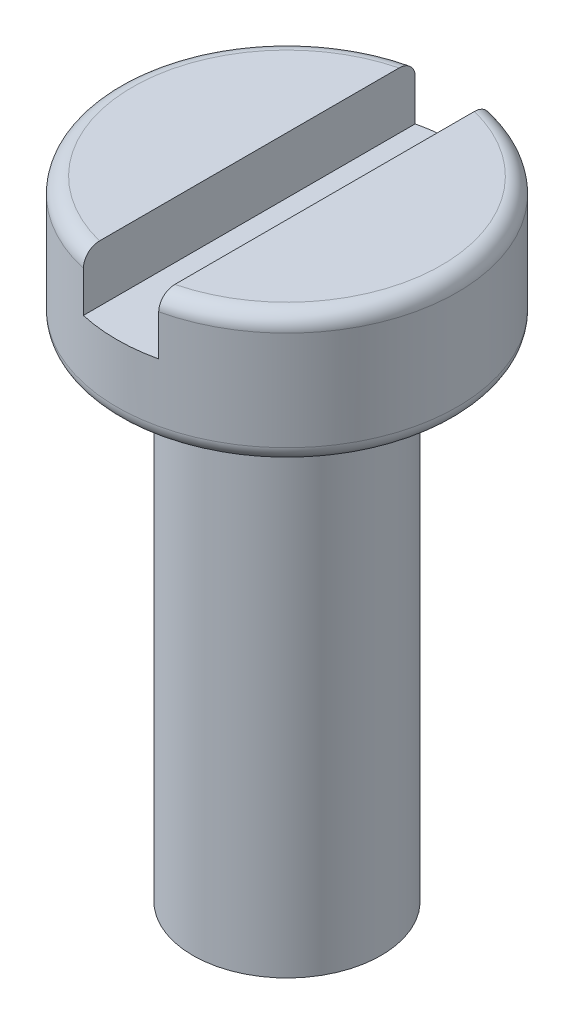
ISO-10303-21;
HEADER;
FILE_DESCRIPTION(('STEP AP214'),'2;1');
FILE_NAME('part.step','',(''),(''),'','','');
FILE_SCHEMA(('AUTOMOTIVE_DESIGN { 1 0 10303 214 1 1 1 1 }'));
ENDSEC;
DATA;
#1=APPLICATION_CONTEXT('core data for automotive mechanical design processes');
#2=APPLICATION_PROTOCOL_DEFINITION('international standard','automotive_design',2000,#1);
#3=PRODUCT_CONTEXT('',#1,'mechanical');
#4=PRODUCT('Part','Part','',(#3));
#5=PRODUCT_RELATED_PRODUCT_CATEGORY('part','',(#4));
#6=PRODUCT_DEFINITION_FORMATION('','',#4);
#7=PRODUCT_DEFINITION_CONTEXT('part definition',#1,'design');
#8=PRODUCT_DEFINITION('design','',#6,#7);
#9=PRODUCT_DEFINITION_SHAPE('','',#8);
#10=(LENGTH_UNIT() NAMED_UNIT(*) SI_UNIT(.MILLI.,.METRE.));
#11=(NAMED_UNIT(*) PLANE_ANGLE_UNIT() SI_UNIT($,.RADIAN.));
#12=(NAMED_UNIT(*) SI_UNIT($,.STERADIAN.) SOLID_ANGLE_UNIT());
#13=UNCERTAINTY_MEASURE_WITH_UNIT(LENGTH_MEASURE(1.E-05),#10,'distance_accuracy_value','');
#14=(GEOMETRIC_REPRESENTATION_CONTEXT(3) GLOBAL_UNCERTAINTY_ASSIGNED_CONTEXT((#13)) GLOBAL_UNIT_ASSIGNED_CONTEXT((#10,
#11,#12)) REPRESENTATION_CONTEXT('',''));
#15=CARTESIAN_POINT('',(0.,0.,0.));
#16=DIRECTION('',(0.,0.,1.));
#17=DIRECTION('',(1.,0.,0.));
#18=AXIS2_PLACEMENT_3D('',#15,#16,#17);
#19=CARTESIAN_POINT('',(0.,20.,0.));
#20=DIRECTION('',(0.,-1.,0.));
#21=DIRECTION('',(0.,0.,-1.));
#22=AXIS2_PLACEMENT_3D('',#19,#20,#21);
#23=PLANE('',#22);
#24=CARTESIAN_POINT('',(0.,20.,0.));
#25=DIRECTION('',(0.,-1.,0.));
#26=DIRECTION('',(0.,0.,-1.));
#27=AXIS2_PLACEMENT_3D('',#24,#25,#26);
#28=CIRCLE('',#27,2.46);
#29=CARTESIAN_POINT('',(-0.6,20.,-2.38570744224846));
#30=VERTEX_POINT('',#29);
#31=CARTESIAN_POINT('',(-0.6,20.,2.3857074422486));
#32=VERTEX_POINT('',#31);
#33=EDGE_CURVE('E104',#30,#32,#28,.F.);
#34=ORIENTED_EDGE('',*,*,#33,.T.);
#35=DIRECTION('',(0.,0.,1.));
#36=VECTOR('',#35,1.);
#37=CARTESIAN_POINT('',(-0.6,20.,2.71102334228302));
#38=LINE('',#37,#36);
#39=EDGE_CURVE('E101',#30,#32,#38,.T.);
#40=ORIENTED_EDGE('',*,*,#39,.F.);
#41=EDGE_LOOP('',(#34,#40));
#42=FACE_BOUND('',#41,.T.);
#43=ADVANCED_FACE('F35',(#42),#23,.F.);
#44=CARTESIAN_POINT('',(0.,19.75,0.));
#45=DIRECTION('',(0.,-1.,0.));
#46=DIRECTION('',(0.,0.,-1.));
#47=AXIS2_PLACEMENT_3D('',#44,#45,#46);
#48=TOROIDAL_SURFACE('',#47,2.46,0.25);
#49=CARTESIAN_POINT('',(-0.6,19.9057779269637,2.58686231688076));
#50=CARTESIAN_POINT('',(-0.6,19.8950398183509,2.5956435679496));
#51=CARTESIAN_POINT('',(-0.6,19.8835649113459,2.60353742344512));
#52=CARTESIAN_POINT('',(-0.6,19.8594480937063,2.61730071427246));
#53=CARTESIAN_POINT('',(-0.6,19.846805116745,2.62316827619331));
#54=CARTESIAN_POINT('',(-0.6,19.8207049337922,2.63268735414627));
#55=CARTESIAN_POINT('',(-0.6,19.8072475164309,2.63633829216775));
#56=CARTESIAN_POINT('',(-0.6,19.7799107452415,2.64130101178219));
#57=CARTESIAN_POINT('',(-0.6,19.7660314865879,2.64261331708466));
#58=CARTESIAN_POINT('',(-0.6,19.738395178757,2.64285617965291));
#59=CARTESIAN_POINT('',(-0.6,19.7246383380415,2.64181105425246));
#60=CARTESIAN_POINT('',(-0.6,19.6974964874994,2.6374228928476));
#61=CARTESIAN_POINT('',(-0.6,19.6841114783171,2.63407985286123));
#62=CARTESIAN_POINT('',(-0.6,19.6581028909833,2.62520726129129));
#63=CARTESIAN_POINT('',(-0.6,19.645478566111,2.61967989560636));
#64=CARTESIAN_POINT('',(-0.6,19.6213204884943,2.60661096468353));
#65=CARTESIAN_POINT('',(-0.6,19.609786785512,2.59906930759908));
#66=CARTESIAN_POINT('',(-0.6,19.5879670918565,2.58208635128699));
#67=CARTESIAN_POINT('',(-0.6,19.5776997639723,2.57262109024571));
#68=CARTESIAN_POINT('',(-0.6,19.5588555560857,2.55213651548936));
#69=CARTESIAN_POINT('',(-0.6,19.5502788528209,2.54111703950326));
#70=CARTESIAN_POINT('',(-0.6,19.5348419859735,2.51756279317136));
#71=CARTESIAN_POINT('',(-0.6,19.5280268479349,2.50499852227153));
#72=CARTESIAN_POINT('',(-0.6,19.5165412180445,2.47892562165189));
#73=CARTESIAN_POINT('',(-0.6,19.5118710171225,2.46541686411225));
#74=CARTESIAN_POINT('',(-0.6,19.5046834040679,2.43746147305775));
#75=CARTESIAN_POINT('',(-0.6,19.5022253760787,2.42299956182772));
#76=CARTESIAN_POINT('',(-0.6,19.4997225636304,2.39386809017465));
#77=CARTESIAN_POINT('',(-0.6,19.4996780748111,2.37919850453324));
#78=CARTESIAN_POINT('',(-0.6,19.5020180153436,2.3497740984476));
#79=CARTESIAN_POINT('',(-0.6,19.5044483852974,2.3350229106946));
#80=CARTESIAN_POINT('',(-0.6,19.5117449070815,2.30613455183196));
#81=CARTESIAN_POINT('',(-0.6,19.5166111916129,2.29199741421948));
#82=CARTESIAN_POINT('',(-0.6,19.5286718984968,2.26471817845948));
#83=CARTESIAN_POINT('',(-0.6,19.5358709457048,2.25157812149445));
#84=CARTESIAN_POINT('',(-0.6,19.5524143077675,2.22672417348261));
#85=CARTESIAN_POINT('',(-0.6,19.5617584549328,2.21501017106599));
#86=CARTESIAN_POINT('',(-0.6,19.5821446976601,2.19359931327809));
#87=CARTESIAN_POINT('',(-0.6,19.5931500850528,2.18386754370457));
#88=CARTESIAN_POINT('',(-0.6,19.6166881125292,2.16646889601282));
#89=CARTESIAN_POINT('',(-0.6,19.6292204309981,2.15880158414973));
#90=CARTESIAN_POINT('',(-0.6,19.654994143128,2.14603352411427));
#91=CARTESIAN_POINT('',(-0.6,19.6681962508577,2.14085347697661));
#92=CARTESIAN_POINT('',(-0.6,19.6952992227209,2.13286505733002));
#93=CARTESIAN_POINT('',(-0.6,19.7091999374493,2.13005617998664));
#94=CARTESIAN_POINT('',(-0.6,19.7368363949329,2.12696449025801));
#95=CARTESIAN_POINT('',(-0.6,19.7505636233152,2.12660516557791));
#96=CARTESIAN_POINT('',(-0.6,19.7778789014398,2.12822242302424));
#97=CARTESIAN_POINT('',(-0.6,19.7914669628874,2.13019880703996));
#98=CARTESIAN_POINT('',(-0.6,19.8179788523567,2.13638478002833));
#99=CARTESIAN_POINT('',(-0.6,19.8309079857046,2.14057171283409));
#100=CARTESIAN_POINT('',(-0.6,19.8558965522215,2.15102236109181));
#101=CARTESIAN_POINT('',(-0.6,19.8679559346654,2.15728619755261));
#102=CARTESIAN_POINT('',(-0.6,19.8910843669919,2.17180899084781));
#103=CARTESIAN_POINT('',(-0.6,19.9021337939875,2.18009916085056));
#104=CARTESIAN_POINT('',(-0.6,19.9227404635454,2.19836203634967));
#105=CARTESIAN_POINT('',(-0.6,19.9322974761134,2.20833500068789));
#106=CARTESIAN_POINT('',(-0.6,19.9499851160373,2.23003056226405));
#107=CARTESIAN_POINT('',(-0.6,19.958058183776,2.24180007994945));
#108=CARTESIAN_POINT('',(-0.6,19.972186772722,2.26649331028083));
#109=CARTESIAN_POINT('',(-0.6,19.9782419447608,2.27941722218843));
#110=CARTESIAN_POINT('',(-0.6,19.9883586493524,2.30650202512867));
#111=CARTESIAN_POINT('',(-0.6,19.9923493322226,2.32068941039095));
#112=CARTESIAN_POINT('',(-0.6,19.9979369938959,2.34952799110328));
#113=CARTESIAN_POINT('',(-0.6,19.9995337847543,2.36417922287773));
#114=CARTESIAN_POINT('',(-0.6,20.000296327843,2.39379345631476));
#115=CARTESIAN_POINT('',(-0.6,19.9994206262247,2.40875754873725));
#116=CARTESIAN_POINT('',(-0.6,19.9951594147004,2.43832912201416));
#117=CARTESIAN_POINT('',(-0.6,19.9917732700265,2.45293651171087));
#118=CARTESIAN_POINT('',(-0.6,19.9825823199898,2.48131275745753));
#119=CARTESIAN_POINT('',(-0.6,19.9767860479825,2.49508437744055));
#120=CARTESIAN_POINT('',(-0.6,19.9629195439454,2.5214172843565));
#121=CARTESIAN_POINT('',(-0.6,19.9548522718015,2.53398011833989));
#122=CARTESIAN_POINT('',(-0.6,19.9399012555252,2.55332109446276));
#123=CARTESIAN_POINT('',(-0.6,19.9336151471017,2.56056880475899));
#124=CARTESIAN_POINT('',(-0.6,19.9202625315426,2.57430626948078));
#125=CARTESIAN_POINT('',(-0.6,19.9131960419394,2.58079604092775));
#126=CARTESIAN_POINT('',(-0.6,19.9057779269637,2.58686231688076));
#127=B_SPLINE_CURVE_WITH_KNOTS('',3,(#49,#50,#51,#52,#53,#54,#55,#56,#57,#58,#59,#60,#61,#62,
#63,#64,#65,#66,#67,#68,#69,#70,#71,#72,#73,#74,#75,#76,#77,#78,#79,#80,#81,#82,#83,#84,#85,#86,
#87,#88,#89,#90,#91,#92,#93,#94,#95,#96,#97,#98,#99,#100,#101,#102,#103,#104,#105,#106,#107,
#108,#109,#110,#111,#112,#113,#114,#115,#116,#117,#118,#119,#120,#121,#122,#123,#124,#125,#126),
.UNSPECIFIED.,.T.,.F.,(4,2,2,2,2,2,2,2,2,2,2,2,2,2,2,2,2,2,2,2,2,2,2,2,2,2,2,2,2,2,2,2,2,2,2,2,
2,2,4),(0.,0.0415802938971037,0.083198928600957,0.124828411195371,0.166448570180792,
0.207641375076417,0.248834251353299,0.289986009055909,0.331139643494163,0.372841362924238,
0.414547439535753,0.457232632476987,0.499923613339573,0.543729095436656,0.587539943353091,
0.632179143563909,0.676820775845968,0.721551460228282,0.766278649058879,0.810132680496136,
0.853977490950431,0.896312268610293,0.938638030699984,0.979635425017785,1.02062934225808,
1.06121103910052,1.10179510081268,1.14304877711473,1.18430880471495,1.22693204392473,
1.26956265466308,1.3135726975485,1.35758619548361,1.40234198477537,1.44710909447208,
1.49171903241248,1.53627109549314,1.56499629658943,1.59372085246534),.UNSPECIFIED.);
#128=CARTESIAN_POINT('',(-0.6,19.75,2.64274478525649));
#129=VERTEX_POINT('',#128);
#130=EDGE_CURVE('E58',#32,#129,#127,.T.);
#131=ORIENTED_EDGE('',*,*,#130,.F.);
#132=ORIENTED_EDGE('',*,*,#33,.F.);
#133=CARTESIAN_POINT('',(-0.6,19.8944024686671,-2.17466848008618));
#134=CARTESIAN_POINT('',(-0.6,19.883309846262,-2.16652688736432));
#135=CARTESIAN_POINT('',(-0.6,19.8715393901536,-2.15929544056344));
#136=CARTESIAN_POINT('',(-0.6,19.8469488212528,-2.14689265741792));
#137=CARTESIAN_POINT('',(-0.6,19.8341278870049,-2.14172295221508));
#138=CARTESIAN_POINT('',(-0.6,19.8077853460394,-2.13362409480365));
#139=CARTESIAN_POINT('',(-0.6,19.794263294155,-2.13069638519483));
#140=CARTESIAN_POINT('',(-0.6,19.7669202433074,-2.12719403278441));
#141=CARTESIAN_POINT('',(-0.6,19.7530993134886,-2.12661885146695));
#142=CARTESIAN_POINT('',(-0.6,19.7257732920088,-2.12783146110016));
#143=CARTESIAN_POINT('',(-0.6,19.712266594452,-2.12958343059428));
#144=CARTESIAN_POINT('',(-0.6,19.6857384749176,-2.13532569735921));
#145=CARTESIAN_POINT('',(-0.6,19.6727170604,-2.13931602902404));
#146=CARTESIAN_POINT('',(-0.6,19.6474863404887,-2.1494105923049));
#147=CARTESIAN_POINT('',(-0.6,19.635279076258,-2.15551991523306));
#148=CARTESIAN_POINT('',(-0.6,19.6120284455293,-2.16965153318031));
#149=CARTESIAN_POINT('',(-0.6,19.6009852039983,-2.17767403329327));
#150=CARTESIAN_POINT('',(-0.6,19.5800642470021,-2.19561844754873));
#151=CARTESIAN_POINT('',(-0.6,19.5702241638525,-2.20558420676426));
#152=CARTESIAN_POINT('',(-0.6,19.5522879155651,-2.22697713536075));
#153=CARTESIAN_POINT('',(-0.6,19.5441920464871,-2.23840455231715));
#154=CARTESIAN_POINT('',(-0.6,19.5296784229926,-2.26282410847462));
#155=CARTESIAN_POINT('',(-0.6,19.5233291210497,-2.27585694646556));
#156=CARTESIAN_POINT('',(-0.6,19.5128429916506,-2.30278438881787));
#157=CARTESIAN_POINT('',(-0.6,19.5087065078549,-2.31667912666237));
#158=CARTESIAN_POINT('',(-0.6,19.5026635081991,-2.34533487622194));
#159=CARTESIAN_POINT('',(-0.6,19.500819560799,-2.36010911604456));
#160=CARTESIAN_POINT('',(-0.6,19.4996171492246,-2.38975919377417));
#161=CARTESIAN_POINT('',(-0.6,19.500258861375,-2.40463503881397));
#162=CARTESIAN_POINT('',(-0.6,19.5040358851863,-2.43418181941932));
#163=CARTESIAN_POINT('',(-0.6,19.5071898869517,-2.44885037722511));
#164=CARTESIAN_POINT('',(-0.6,19.5159467663178,-2.47743847402221));
#165=CARTESIAN_POINT('',(-0.6,19.5215495385545,-2.49135804521147));
#166=CARTESIAN_POINT('',(-0.6,19.5349828775226,-2.51785900108877));
#167=CARTESIAN_POINT('',(-0.6,19.5427846303755,-2.53045497621151));
#168=CARTESIAN_POINT('',(-0.6,19.5604427436654,-2.55411450413128));
#169=CARTESIAN_POINT('',(-0.6,19.5702988333929,-2.56517825851681));
#170=CARTESIAN_POINT('',(-0.6,19.5915255957485,-2.58516246124834));
#171=CARTESIAN_POINT('',(-0.6,19.6028525595357,-2.59412932678523));
#172=CARTESIAN_POINT('',(-0.6,19.6268844133151,-2.60997367876158));
#173=CARTESIAN_POINT('',(-0.6,19.639589089596,-2.61685148862899));
#174=CARTESIAN_POINT('',(-0.6,19.665659389012,-2.6281382460571));
#175=CARTESIAN_POINT('',(-0.6,19.6789992721377,-2.6326066819527));
#176=CARTESIAN_POINT('',(-0.6,19.7062466045649,-2.6391957173654));
#177=CARTESIAN_POINT('',(-0.6,19.7201539880588,-2.64131658831051));
#178=CARTESIAN_POINT('',(-0.6,19.7478812567646,-2.64312421655654));
#179=CARTESIAN_POINT('',(-0.6,19.7616984300182,-2.64285282687362));
#180=CARTESIAN_POINT('',(-0.6,19.7890887423948,-2.63998487487521));
#181=CARTESIAN_POINT('',(-0.6,19.8026618917013,-2.63738840981912));
#182=CARTESIAN_POINT('',(-0.6,19.8291322877508,-2.62996726244901));
#183=CARTESIAN_POINT('',(-0.6,19.8420317379529,-2.62515042644825));
#184=CARTESIAN_POINT('',(-0.6,19.8668513236063,-2.61344256334287));
#185=CARTESIAN_POINT('',(-0.6,19.8787714252024,-2.60655146457123));
#186=CARTESIAN_POINT('',(-0.6,19.901442031466,-2.59081746857535));
#187=CARTESIAN_POINT('',(-0.6,19.9121780352306,-2.58195369313075));
#188=CARTESIAN_POINT('',(-0.6,19.9320495300079,-2.56258513390767));
#189=CARTESIAN_POINT('',(-0.6,19.9411848615979,-2.55208018686957));
#190=CARTESIAN_POINT('',(-0.6,19.9578158880632,-2.52948107517064));
#191=CARTESIAN_POINT('',(-0.6,19.9652706100935,-2.51735676836809));
#192=CARTESIAN_POINT('',(-0.6,19.9780989930115,-2.49205357024425));
#193=CARTESIAN_POINT('',(-0.6,19.983472374073,-2.47887453740736));
#194=CARTESIAN_POINT('',(-0.6,19.9921323415263,-2.45146527387591));
#195=CARTESIAN_POINT('',(-0.6,19.9953602692204,-2.43721650353487));
#196=CARTESIAN_POINT('',(-0.6,19.9994319700037,-2.40838263421632));
#197=CARTESIAN_POINT('',(-0.6,20.0002755259457,-2.39379750472817));
#198=CARTESIAN_POINT('',(-0.6,19.999559832905,-2.36438314286838));
#199=CARTESIAN_POINT('',(-0.6,19.9979504524109,-2.34955511187288));
#200=CARTESIAN_POINT('',(-0.6,19.9922792732344,-2.3203705929169));
#201=CARTESIAN_POINT('',(-0.6,19.9882167164322,-2.3060142521724));
#202=CARTESIAN_POINT('',(-0.6,19.9777097480094,-2.27810596316031));
#203=CARTESIAN_POINT('',(-0.6,19.9712516736316,-2.2645591569393));
#204=CARTESIAN_POINT('',(-0.6,19.9561211900623,-2.23877753931798));
#205=CARTESIAN_POINT('',(-0.6,19.9474515009904,-2.22654114227506));
#206=CARTESIAN_POINT('',(-0.6,19.9313801864166,-2.20759176204346));
#207=CARTESIAN_POINT('',(-0.6,19.9245303985509,-2.20040383931934));
#208=CARTESIAN_POINT('',(-0.6,19.9100385586368,-2.1868758926182));
#209=CARTESIAN_POINT('',(-0.6,19.9023965328193,-2.18053584058426));
#210=CARTESIAN_POINT('',(-0.6,19.8944024686671,-2.17466848008618));
#211=B_SPLINE_CURVE_WITH_KNOTS('',3,(#133,#134,#135,#136,#137,#138,#139,#140,#141,#142,#143,
#144,#145,#146,#147,#148,#149,#150,#151,#152,#153,#154,#155,#156,#157,#158,#159,#160,#161,#162,
#163,#164,#165,#166,#167,#168,#169,#170,#171,#172,#173,#174,#175,#176,#177,#178,#179,#180,#181,
#182,#183,#184,#185,#186,#187,#188,#189,#190,#191,#192,#193,#194,#195,#196,#197,#198,#199,#200,
#201,#202,#203,#204,#205,#206,#207,#208,#209,#210),.UNSPECIFIED.,.T.,.F.,(4,2,2,2,2,2,2,2,2,2,2,
2,2,2,2,2,2,2,2,2,2,2,2,2,2,2,2,2,2,2,2,2,2,2,2,2,2,2,4),(0.,0.041244633660872,
0.0825218334872765,0.123825570637018,0.165119852443379,0.205785806789995,0.246452386014894,
0.287217359785701,0.327986705554893,0.369812851829636,0.411646092017453,0.454939786369004,
0.498240202472458,0.542698143433272,0.587159238152734,0.63195422432254,0.67674728327372,
0.720978707422788,0.765204306670547,0.808331228569678,0.851451470144276,0.893451661420113,
0.935446996080551,0.976709093215098,1.01796946441029,1.05908513509269,1.10020222650887,
1.14177714209757,1.18335619609043,1.22585974121034,1.26836899874418,1.31199731328668,
1.3556296009759,1.40016564967373,1.44471546866291,1.48952338396887,1.534276452409,
1.56400099805382,1.59372455983925),.UNSPECIFIED.);
#212=CARTESIAN_POINT('',(-0.6,19.75,-2.64274478525636));
#213=VERTEX_POINT('',#212);
#214=EDGE_CURVE('E94',#213,#30,#211,.T.);
#215=ORIENTED_EDGE('',*,*,#214,.F.);
#216=CARTESIAN_POINT('',(0.,19.75,0.));
#217=DIRECTION('',(0.,-1.,0.));
#218=DIRECTION('',(0.,0.,-1.));
#219=AXIS2_PLACEMENT_3D('',#216,#217,#218);
#220=CIRCLE('',#219,2.71);
#221=EDGE_CURVE('E109',#129,#213,#220,.T.);
#222=ORIENTED_EDGE('',*,*,#221,.F.);
#223=EDGE_LOOP('',(#131,#132,#215,#222));
#224=FACE_BOUND('',#223,.T.);
#225=ADVANCED_FACE('F153',(#224),#48,.T.);
#226=CARTESIAN_POINT('',(0.,10.,0.));
#227=DIRECTION('',(0.,1.,0.));
#228=DIRECTION('',(0.,0.,1.));
#229=AXIS2_PLACEMENT_3D('',#226,#227,#228);
#230=CYLINDRICAL_SURFACE('',#229,2.71);
#231=ORIENTED_EDGE('',*,*,#221,.T.);
#232=DIRECTION('',(0.,1.,0.));
#233=VECTOR('',#232,1.);
#234=CARTESIAN_POINT('',(-0.6,10.,-2.64274478525642));
#235=LINE('',#234,#233);
#236=CARTESIAN_POINT('',(-0.6,19.1,-2.64274478525636));
#237=VERTEX_POINT('',#236);
#238=EDGE_CURVE('E175',#213,#237,#235,.F.);
#239=ORIENTED_EDGE('',*,*,#238,.T.);
#240=CARTESIAN_POINT('',(0.,19.1,0.));
#241=DIRECTION('',(0.,1.,0.));
#242=DIRECTION('',(0.,0.,1.));
#243=AXIS2_PLACEMENT_3D('',#240,#241,#242);
#244=CIRCLE('',#243,2.71);
#245=CARTESIAN_POINT('',(0.6,19.1,-2.64274478525636));
#246=VERTEX_POINT('',#245);
#247=EDGE_CURVE('E12',#246,#237,#244,.T.);
#248=ORIENTED_EDGE('',*,*,#247,.F.);
#249=DIRECTION('',(0.,1.,0.));
#250=VECTOR('',#249,1.);
#251=CARTESIAN_POINT('',(0.6,10.,-2.64274478525642));
#252=LINE('',#251,#250);
#253=CARTESIAN_POINT('',(0.6,19.7500000000013,-2.64274478526424));
#254=VERTEX_POINT('',#253);
#255=EDGE_CURVE('E183',#246,#254,#252,.T.);
#256=ORIENTED_EDGE('',*,*,#255,.T.);
#257=CARTESIAN_POINT('',(0.6,19.75,2.64274478525649));
#258=VERTEX_POINT('',#257);
#259=EDGE_CURVE('E105',#254,#258,#220,.T.);
#260=ORIENTED_EDGE('',*,*,#259,.T.);
#261=DIRECTION('',(0.,1.,0.));
#262=VECTOR('',#261,1.);
#263=CARTESIAN_POINT('',(0.6,9.99999999999998,2.64274478525642));
#264=LINE('',#263,#262);
#265=CARTESIAN_POINT('',(0.6,19.1,2.64274478525648));
#266=VERTEX_POINT('',#265);
#267=EDGE_CURVE('E89',#258,#266,#264,.F.);
#268=ORIENTED_EDGE('',*,*,#267,.T.);
#269=CARTESIAN_POINT('',(-0.6,19.1,2.64274478525648));
#270=VERTEX_POINT('',#269);
#271=EDGE_CURVE('E39',#270,#266,#244,.T.);
#272=ORIENTED_EDGE('',*,*,#271,.F.);
#273=DIRECTION('',(0.,1.,0.));
#274=VECTOR('',#273,1.);
#275=CARTESIAN_POINT('',(-0.6,9.99999999999998,2.64274478525642));
#276=LINE('',#275,#274);
#277=EDGE_CURVE('E179',#270,#129,#276,.T.);
#278=ORIENTED_EDGE('',*,*,#277,.T.);
#279=EDGE_LOOP('',(#231,#239,#248,#256,#260,#268,#272,#278));
#280=FACE_BOUND('',#279,.T.);
#281=CARTESIAN_POINT('',(0.,18.17,0.));
#282=DIRECTION('',(0.,-1.,0.));
#283=DIRECTION('',(0.,0.,-1.));
#284=AXIS2_PLACEMENT_3D('',#281,#282,#283);
#285=CIRCLE('',#284,2.71);
#286=CARTESIAN_POINT('',(0.,18.17,-2.70999999999994));
#287=VERTEX_POINT('',#286);
#288=EDGE_CURVE('E188',#287,#287,#285,.F.);
#289=ORIENTED_EDGE('',*,*,#288,.T.);
#290=EDGE_LOOP('',(#289));
#291=FACE_BOUND('',#290,.T.);
#292=ADVANCED_FACE('F151',(#280,#291),#230,.T.);
#293=CARTESIAN_POINT('',(0.6,20.,2.3857074422486));
#294=VERTEX_POINT('',#293);
#295=CARTESIAN_POINT('',(0.6,20.,-2.38570744224846));
#296=VERTEX_POINT('',#295);
#297=EDGE_CURVE('E100',#294,#296,#28,.F.);
#298=ORIENTED_EDGE('',*,*,#297,.T.);
#299=DIRECTION('',(0.,0.,-1.));
#300=VECTOR('',#299,1.);
#301=CARTESIAN_POINT('',(0.6,20.,2.71102334228302));
#302=LINE('',#301,#300);
#303=EDGE_CURVE('E50',#294,#296,#302,.T.);
#304=ORIENTED_EDGE('',*,*,#303,.F.);
#305=EDGE_LOOP('',(#298,#304));
#306=FACE_BOUND('',#305,.T.);
#307=ADVANCED_FACE('F99',(#306),#23,.F.);
#308=CARTESIAN_POINT('',(0.,17.92,0.));
#309=DIRECTION('',(0.,-1.,0.));
#310=DIRECTION('',(0.,0.,-1.));
#311=AXIS2_PLACEMENT_3D('',#308,#309,#310);
#312=PLANE('',#311);
#313=CARTESIAN_POINT('',(0.,17.92,0.));
#314=DIRECTION('',(0.,-1.,0.));
#315=DIRECTION('',(0.,0.,-1.));
#316=AXIS2_PLACEMENT_3D('',#313,#314,#315);
#317=CIRCLE('',#316,1.65);
#318=CARTESIAN_POINT('',(0.,17.92,-1.64999999999994));
#319=VERTEX_POINT('',#318);
#320=EDGE_CURVE('E118',#319,#319,#317,.F.);
#321=ORIENTED_EDGE('',*,*,#320,.T.);
#322=EDGE_LOOP('',(#321));
#323=FACE_BOUND('',#322,.T.);
#324=CARTESIAN_POINT('',(0.,17.92,0.));
#325=DIRECTION('',(0.,-1.,0.));
#326=DIRECTION('',(0.,0.,-1.));
#327=AXIS2_PLACEMENT_3D('',#324,#325,#326);
#328=CIRCLE('',#327,2.46);
#329=CARTESIAN_POINT('',(0.,17.92,-2.45999999999994));
#330=VERTEX_POINT('',#329);
#331=EDGE_CURVE('E108',#330,#330,#328,.T.);
#332=ORIENTED_EDGE('',*,*,#331,.T.);
#333=EDGE_LOOP('',(#332));
#334=FACE_BOUND('',#333,.T.);
#335=ADVANCED_FACE('F142',(#323,#334),#312,.T.);
#336=CARTESIAN_POINT('',(0.,17.92,0.));
#337=DIRECTION('',(0.,-1.,0.));
#338=DIRECTION('',(0.,0.,-1.));
#339=AXIS2_PLACEMENT_3D('',#336,#337,#338);
#340=CYLINDRICAL_SURFACE('',#339,1.5);
#341=CARTESIAN_POINT('',(0.,17.77,0.));
#342=DIRECTION('',(0.,-1.,0.));
#343=DIRECTION('',(0.,0.,-1.));
#344=AXIS2_PLACEMENT_3D('',#341,#342,#343);
#345=CIRCLE('',#344,1.5);
#346=CARTESIAN_POINT('',(0.,17.77,-1.49999999999995));
#347=VERTEX_POINT('',#346);
#348=EDGE_CURVE('E115',#347,#347,#345,.T.);
#349=ORIENTED_EDGE('',*,*,#348,.T.);
#350=EDGE_LOOP('',(#349));
#351=FACE_BOUND('',#350,.T.);
#352=CARTESIAN_POINT('',(0.,10.,0.));
#353=DIRECTION('',(0.,-1.,0.));
#354=DIRECTION('',(0.,0.,-1.));
#355=AXIS2_PLACEMENT_3D('',#352,#353,#354);
#356=CIRCLE('',#355,1.5);
#357=CARTESIAN_POINT('',(0.,10.,-1.5));
#358=VERTEX_POINT('',#357);
#359=EDGE_CURVE('E181',#358,#358,#356,.T.);
#360=ORIENTED_EDGE('',*,*,#359,.F.);
#361=EDGE_LOOP('',(#360));
#362=FACE_BOUND('',#361,.T.);
#363=ADVANCED_FACE('F137',(#351,#362),#340,.T.);
#364=CARTESIAN_POINT('',(0.,10.,0.));
#365=DIRECTION('',(0.,-1.,0.));
#366=DIRECTION('',(0.,0.,-1.));
#367=AXIS2_PLACEMENT_3D('',#364,#365,#366);
#368=PLANE('',#367);
#369=ORIENTED_EDGE('',*,*,#359,.T.);
#370=EDGE_LOOP('',(#369));
#371=FACE_BOUND('',#370,.T.);
#372=ADVANCED_FACE('F141',(#371),#368,.T.);
#373=CARTESIAN_POINT('',(0.6,19.9057779269637,2.58686231688076));
#374=CARTESIAN_POINT('',(0.6,19.9169025931632,2.57776327985589));
#375=CARTESIAN_POINT('',(0.6,19.9272527000197,2.56769785400049));
#376=CARTESIAN_POINT('',(0.6,19.9461122010159,2.54595309368041));
#377=CARTESIAN_POINT('',(0.6,19.9546187661238,2.53427132321102));
#378=CARTESIAN_POINT('',(0.6,19.9695520722048,2.50967246325872));
#379=CARTESIAN_POINT('',(0.6,19.9759821432381,2.4967573951484));
#380=CARTESIAN_POINT('',(0.6,19.986628146274,2.47005100990524));
#381=CARTESIAN_POINT('',(0.6,19.9908446414511,2.4562599166513));
#382=CARTESIAN_POINT('',(0.6,19.9970369963394,2.42789942410108));
#383=CARTESIAN_POINT('',(0.6,19.9989672167057,2.41332005783486));
#384=CARTESIAN_POINT('',(0.6,20.000399004893,2.38404134540786));
#385=CARTESIAN_POINT('',(0.6,19.9999001689155,2.36934197970425));
#386=CARTESIAN_POINT('',(0.6,19.9964620664074,2.33996916480795));
#387=CARTESIAN_POINT('',(0.6,19.9934801924616,2.32530068258425));
#388=CARTESIAN_POINT('',(0.6,19.9850964783542,2.29667109241443));
#389=CARTESIAN_POINT('',(0.6,19.9796945395019,2.2827100133422));
#390=CARTESIAN_POINT('',(0.6,19.9666059424516,2.25590716603894));
#391=CARTESIAN_POINT('',(0.6,19.9589200361884,2.24306503122227));
#392=CARTESIAN_POINT('',(0.6,19.9414563928667,2.21889013776512));
#393=CARTESIAN_POINT('',(0.6,19.9316788602527,2.20755723178169));
#394=CARTESIAN_POINT('',(0.6,19.9105254937946,2.18699962520666));
#395=CARTESIAN_POINT('',(0.6,19.8991890590445,2.17773442381394));
#396=CARTESIAN_POINT('',(0.6,19.8750742873265,2.16132135360425));
#397=CARTESIAN_POINT('',(0.6,19.8622962643812,2.15417302489164));
#398=CARTESIAN_POINT('',(0.6,19.8361430033382,2.14246442389688));
#399=CARTESIAN_POINT('',(0.6,19.8228045123803,2.13782205869663));
#400=CARTESIAN_POINT('',(0.6,19.7955250040227,2.13092034608472));
#401=CARTESIAN_POINT('',(0.6,19.7815841099168,2.12866051342263));
#402=CARTESIAN_POINT('',(0.6,19.7539410419268,2.12663860571753));
#403=CARTESIAN_POINT('',(0.6,19.7402441136823,2.12680418647436));
#404=CARTESIAN_POINT('',(0.6,19.7130767965782,2.12945106075111));
#405=CARTESIAN_POINT('',(0.6,19.6996063923996,2.13193219703183));
#406=CARTESIAN_POINT('',(0.6,19.6733683618953,2.13909636739112));
#407=CARTESIAN_POINT('',(0.6,19.6605964526621,2.14376376420775));
#408=CARTESIAN_POINT('',(0.6,19.6359964621806,2.15513746178243));
#409=CARTESIAN_POINT('',(0.6,19.6241684496797,2.1618439108812));
#410=CARTESIAN_POINT('',(0.6,19.601542619827,2.17722920089875));
#411=CARTESIAN_POINT('',(0.6,19.5907687327629,2.18594319676499));
#412=CARTESIAN_POINT('',(0.6,19.5707767489848,2.20500208607076));
#413=CARTESIAN_POINT('',(0.6,19.5615588986955,2.21534723733057));
#414=CARTESIAN_POINT('',(0.6,19.5446090167065,2.23774802957973));
#415=CARTESIAN_POINT('',(0.6,19.5369378372795,2.24984971468583));
#416=CARTESIAN_POINT('',(0.6,19.5236639771517,2.27513870448689));
#417=CARTESIAN_POINT('',(0.6,19.5180616451257,2.28832619172072));
#418=CARTESIAN_POINT('',(0.6,19.5089124037288,2.31585523933381));
#419=CARTESIAN_POINT('',(0.6,19.5054351383223,2.33021997799191));
#420=CARTESIAN_POINT('',(0.6,19.5009020956458,2.35932719775068));
#421=CARTESIAN_POINT('',(0.6,19.4998465754812,2.37406971879079));
#422=CARTESIAN_POINT('',(0.6,19.500191900761,2.40374444974833));
#423=CARTESIAN_POINT('',(0.6,19.5016291241333,2.41867625833318));
#424=CARTESIAN_POINT('',(0.6,19.5070052730212,2.4480835471559));
#425=CARTESIAN_POINT('',(0.6,19.5109441857128,2.46255902973257));
#426=CARTESIAN_POINT('',(0.6,19.5212025541868,2.49053982214567));
#427=CARTESIAN_POINT('',(0.6,19.5275070839278,2.50405059558232));
#428=CARTESIAN_POINT('',(0.6,19.5423437493798,2.52978919121932));
#429=CARTESIAN_POINT('',(0.6,19.5508756501157,2.54201714855893));
#430=CARTESIAN_POINT('',(0.6,19.5697308086526,2.56455203293997));
#431=CARTESIAN_POINT('',(0.6,19.5800108798647,2.57489507872222));
#432=CARTESIAN_POINT('',(0.6,19.6022035649378,2.59365023100117));
#433=CARTESIAN_POINT('',(0.6,19.6141159286871,2.60206263279815));
#434=CARTESIAN_POINT('',(0.6,19.6388907140877,2.61647986456498));
#435=CARTESIAN_POINT('',(0.6,19.6517190987736,2.62254319932373));
#436=CARTESIAN_POINT('',(0.6,19.6782260522056,2.63237633658921));
#437=CARTESIAN_POINT('',(0.6,19.6919044706715,2.63614654324103));
#438=CARTESIAN_POINT('',(0.6,19.7194094189198,2.64121297015998));
#439=CARTESIAN_POINT('',(0.6,19.7332265625517,2.6425602568666));
#440=CARTESIAN_POINT('',(0.6,19.7608928583866,2.64289385113037));
#441=CARTESIAN_POINT('',(0.6,19.774742016277,2.64187970079877));
#442=CARTESIAN_POINT('',(0.6,19.8019561619789,2.63754148316974));
#443=CARTESIAN_POINT('',(0.6,19.815324162739,2.63423619107647));
#444=CARTESIAN_POINT('',(0.6,19.8413082690277,2.62544269741125));
#445=CARTESIAN_POINT('',(0.6,19.8539252946826,2.61995723313255));
#446=CARTESIAN_POINT('',(0.6,19.8730332193186,2.60969009171426));
#447=CARTESIAN_POINT('',(0.6,19.8798865254629,2.60556723403541));
#448=CARTESIAN_POINT('',(0.6,19.8931656993693,2.59668329687964));
#449=CARTESIAN_POINT('',(0.6,19.8995915754082,2.59192222976658));
#450=CARTESIAN_POINT('',(0.6,19.9057779269637,2.58686231688076));
#451=B_SPLINE_CURVE_WITH_KNOTS('',3,(#373,#374,#375,#376,#377,#378,#379,#380,#381,#382,#383,
#384,#385,#386,#387,#388,#389,#390,#391,#392,#393,#394,#395,#396,#397,#398,#399,#400,#401,#402,
#403,#404,#405,#406,#407,#408,#409,#410,#411,#412,#413,#414,#415,#416,#417,#418,#419,#420,#421,
#422,#423,#424,#425,#426,#427,#428,#429,#430,#431,#432,#433,#434,#435,#436,#437,#438,#439,#440,
#441,#442,#443,#444,#445,#446,#447,#448,#449,#450),.UNSPECIFIED.,.T.,.F.,(4,2,2,2,2,2,2,2,2,2,2,
2,2,2,2,2,2,2,2,2,2,2,2,2,2,2,2,2,2,2,2,2,2,2,2,2,2,2,4),(0.,0.0430855035237854,
0.0862366635233199,0.129318274607084,0.172388919614342,0.216305594472259,0.260229570146706,
0.304923169830728,0.34961859229368,0.394299316262213,0.438975674939816,0.482680087516964,
0.526374998229287,0.56853498279318,0.610686378972844,0.651583128943029,0.692477101996985,
0.733082945051566,0.773691742881658,0.81507448531775,0.856463775275982,0.899254000364514,
0.942051433847857,0.986185237027289,1.03032372547284,1.07511178195504,1.11989960884705,
1.1644094698361,1.20891463718075,1.25244794006747,1.29597457990448,1.33833417215876,
1.38068629671607,1.42213483739557,1.46359141572345,1.50471222537862,1.54578156849128,
1.56974158940085,1.59370114620628),.UNSPECIFIED.);
#452=EDGE_CURVE('E85',#258,#294,#451,.T.);
#453=ORIENTED_EDGE('',*,*,#452,.F.);
#454=ORIENTED_EDGE('',*,*,#259,.F.);
#455=CARTESIAN_POINT('',(0.6,19.8944024686671,-2.17466848008618));
#456=CARTESIAN_POINT('',(0.6,19.9060570400945,-2.18322407893569));
#457=CARTESIAN_POINT('',(0.6,19.9169803248193,-2.19279758526086));
#458=CARTESIAN_POINT('',(0.6,19.9370611188982,-2.21366339300844));
#459=CARTESIAN_POINT('',(0.6,19.9462156765038,-2.22495851231939));
#460=CARTESIAN_POINT('',(0.6,19.9625027797233,-2.24889217502332));
#461=CARTESIAN_POINT('',(0.6,19.9696390209244,-2.2615282040408));
#462=CARTESIAN_POINT('',(0.6,19.9817402400606,-2.28779372765297));
#463=CARTESIAN_POINT('',(0.6,19.9867058285108,-2.30142294164593));
#464=CARTESIAN_POINT('',(0.6,19.994440068445,-2.32962016359587));
#465=CARTESIAN_POINT('',(0.6,19.9971570709489,-2.34420235461865));
#466=CARTESIAN_POINT('',(0.6,20.0001358276639,-2.37361704300086));
#467=CARTESIAN_POINT('',(0.6,20.0003972219943,-2.38844957673009));
#468=CARTESIAN_POINT('',(0.6,19.9984385076856,-2.41812153190812));
#469=CARTESIAN_POINT('',(0.6,19.9961900233632,-2.43295909723152));
#470=CARTESIAN_POINT('',(0.6,19.9892108448965,-2.4620395481522));
#471=CARTESIAN_POINT('',(0.6,19.9844802137733,-2.47628244883796));
#472=CARTESIAN_POINT('',(0.6,19.9727028760047,-2.50362058722193));
#473=CARTESIAN_POINT('',(0.6,19.9656780879161,-2.51672525526337));
#474=CARTESIAN_POINT('',(0.6,19.9494778455635,-2.54153104070058));
#475=CARTESIAN_POINT('',(0.6,19.9403026547957,-2.55323232979184));
#476=CARTESIAN_POINT('',(0.6,19.9202884054529,-2.57460188991214));
#477=CARTESIAN_POINT('',(0.6,19.9094933420055,-2.58431135240996));
#478=CARTESIAN_POINT('',(0.6,19.8863882309249,-2.60172032836337));
#479=CARTESIAN_POINT('',(0.6,19.8740784175532,-2.60942015204339));
#480=CARTESIAN_POINT('',(0.6,19.8486463685603,-2.62237743443215));
#481=CARTESIAN_POINT('',(0.6,19.8355544254919,-2.62769437342539));
#482=CARTESIAN_POINT('',(0.6,19.8086529489945,-2.63600505557404));
#483=CARTESIAN_POINT('',(0.6,19.7948435066925,-2.63899909298638));
#484=CARTESIAN_POINT('',(0.6,19.7671891401196,-2.64252920065069));
#485=CARTESIAN_POINT('',(0.6,19.7533501846242,-2.64311216803087));
#486=CARTESIAN_POINT('',(0.6,19.7257734102776,-2.64193029103051));
#487=CARTESIAN_POINT('',(0.6,19.7120355857688,-2.64016557900829));
#488=CARTESIAN_POINT('',(0.6,19.6851388628416,-2.63436414671132));
#489=CARTESIAN_POINT('',(0.6,19.6719768948774,-2.63034162727624));
#490=CARTESIAN_POINT('',(0.6,19.6465067528842,-2.62016231911069));
#491=CARTESIAN_POINT('',(0.6,19.6341985977152,-2.61400548325303));
#492=CARTESIAN_POINT('',(0.6,19.6106656855043,-2.59968533150608));
#493=CARTESIAN_POINT('',(0.6,19.5994511971851,-2.59150515482894));
#494=CARTESIAN_POINT('',(0.6,19.5785198481135,-2.573413324907));
#495=CARTESIAN_POINT('',(0.6,19.5688031198337,-2.56350151866972));
#496=CARTESIAN_POINT('',(0.6,19.5509245595677,-2.54201310810556));
#497=CARTESIAN_POINT('',(0.6,19.542798990086,-2.53040634560003));
#498=CARTESIAN_POINT('',(0.6,19.5285537443924,-2.50602163111241));
#499=CARTESIAN_POINT('',(0.6,19.5224343263039,-2.49324352868928));
#500=CARTESIAN_POINT('',(0.6,19.5122063343919,-2.46652106947608));
#501=CARTESIAN_POINT('',(0.6,19.5081546969006,-2.45255491723692));
#502=CARTESIAN_POINT('',(0.6,19.5023959961974,-2.4241472778217));
#503=CARTESIAN_POINT('',(0.6,19.5006892446479,-2.40970572772093));
#504=CARTESIAN_POINT('',(0.6,19.4996397433858,-2.38040959111145));
#505=CARTESIAN_POINT('',(0.6,19.5003512502473,-2.3655530420643));
#506=CARTESIAN_POINT('',(0.6,19.5042345418162,-2.33616415270226));
#507=CARTESIAN_POINT('',(0.6,19.5074065341372,-2.32163183985258));
#508=CARTESIAN_POINT('',(0.6,19.5161699948991,-2.29317473056145));
#509=CARTESIAN_POINT('',(0.6,19.521782435842,-2.2792563789088));
#510=CARTESIAN_POINT('',(0.6,19.535291702791,-2.25257458581238));
#511=CARTESIAN_POINT('',(0.6,19.5431884729361,-2.23981111613708));
#512=CARTESIAN_POINT('',(0.6,19.5609566202444,-2.21598100865319));
#513=CARTESIAN_POINT('',(0.6,19.5708028509134,-2.2048956453758));
#514=CARTESIAN_POINT('',(0.6,19.5922695908807,-2.18459992533316));
#515=CARTESIAN_POINT('',(0.6,19.6038897961554,-2.17538924791429));
#516=CARTESIAN_POINT('',(0.6,19.6281949261132,-2.15941612419893));
#517=CARTESIAN_POINT('',(0.6,19.6408359719508,-2.15258694443165));
#518=CARTESIAN_POINT('',(0.6,19.6671143999394,-2.14123667186962));
#519=CARTESIAN_POINT('',(0.6,19.6807515084726,-2.13671494792317));
#520=CARTESIAN_POINT('',(0.6,19.7081218578869,-2.13026324952045));
#521=CARTESIAN_POINT('',(0.6,19.7218350953147,-2.12824824737505));
#522=CARTESIAN_POINT('',(0.6,19.7494073354562,-2.12659809551568));
#523=CARTESIAN_POINT('',(0.6,19.7632663568098,-2.12696325391353));
#524=CARTESIAN_POINT('',(0.6,19.7904617126021,-2.13003104072805));
#525=CARTESIAN_POINT('',(0.6,19.8038029723233,-2.13269054463269));
#526=CARTESIAN_POINT('',(0.6,19.8298426311236,-2.14019479291303));
#527=CARTESIAN_POINT('',(0.6,19.8425418141583,-2.14503679717482));
#528=CARTESIAN_POINT('',(0.6,19.8617102081237,-2.15421851591737));
#529=CARTESIAN_POINT('',(0.6,19.8685125722415,-2.15788075940237));
#530=CARTESIAN_POINT('',(0.6,19.8817469474741,-2.16582142405663));
#531=CARTESIAN_POINT('',(0.6,19.8881789719767,-2.17009982293254));
#532=CARTESIAN_POINT('',(0.6,19.8944024686671,-2.17466848008618));
#533=B_SPLINE_CURVE_WITH_KNOTS('',3,(#455,#456,#457,#458,#459,#460,#461,#462,#463,#464,#465,
#466,#467,#468,#469,#470,#471,#472,#473,#474,#475,#476,#477,#478,#479,#480,#481,#482,#483,#484,
#485,#486,#487,#488,#489,#490,#491,#492,#493,#494,#495,#496,#497,#498,#499,#500,#501,#502,#503,
#504,#505,#506,#507,#508,#509,#510,#511,#512,#513,#514,#515,#516,#517,#518,#519,#520,#521,#522,
#523,#524,#525,#526,#527,#528,#529,#530,#531,#532),.UNSPECIFIED.,.T.,.F.,(4,2,2,2,2,2,2,2,2,2,2,
2,2,2,2,2,2,2,2,2,2,2,2,2,2,2,2,2,2,2,2,2,2,2,2,2,2,2,4),(0.,0.0433440285060391,
0.0867597786549024,0.130095511088372,0.173419047117662,0.217712064392678,0.262011572912983,
0.306817032206702,0.3516213539565,0.396009556457493,0.440392322760467,0.483735755242152,
0.527072492911341,0.569257294875506,0.611436752145796,0.652791813664912,0.69414454375252,
0.735240047700854,0.776336459124293,0.817787606267617,0.859242417545618,0.901553492425488,
0.943870009162313,0.987296155101078,1.03072807231751,1.07514081058416,1.11955729676431,
1.16436327162598,1.20916815089285,1.25342887261887,1.29768201744366,1.34057062241628,
1.38344748989638,1.42482638848863,1.46621064368623,1.50683357935072,1.54740565465392,
1.57055203781484,1.59369758371812),.UNSPECIFIED.);
#534=EDGE_CURVE('E95',#296,#254,#533,.T.);
#535=ORIENTED_EDGE('',*,*,#534,.F.);
#536=ORIENTED_EDGE('',*,*,#297,.F.);
#537=EDGE_LOOP('',(#453,#454,#535,#536));
#538=FACE_BOUND('',#537,.T.);
#539=ADVANCED_FACE('F103',(#538),#48,.T.);
#540=CARTESIAN_POINT('',(0.,18.17,0.));
#541=DIRECTION('',(0.,-1.,0.));
#542=DIRECTION('',(0.,0.,-1.));
#543=AXIS2_PLACEMENT_3D('',#540,#541,#542);
#544=TOROIDAL_SURFACE('',#543,2.46,0.25);
#545=ORIENTED_EDGE('',*,*,#288,.F.);
#546=EDGE_LOOP('',(#545));
#547=FACE_BOUND('',#546,.T.);
#548=ORIENTED_EDGE('',*,*,#331,.F.);
#549=EDGE_LOOP('',(#548));
#550=FACE_BOUND('',#549,.T.);
#551=ADVANCED_FACE('F205',(#547,#550),#544,.T.);
#552=CARTESIAN_POINT('',(0.,17.77,0.));
#553=DIRECTION('',(0.,-1.,0.));
#554=DIRECTION('',(0.,0.,-1.));
#555=AXIS2_PLACEMENT_3D('',#552,#553,#554);
#556=TOROIDAL_SURFACE('',#555,1.65,0.15);
#557=ORIENTED_EDGE('',*,*,#320,.F.);
#558=EDGE_LOOP('',(#557));
#559=FACE_BOUND('',#558,.T.);
#560=ORIENTED_EDGE('',*,*,#348,.F.);
#561=EDGE_LOOP('',(#560));
#562=FACE_BOUND('',#561,.T.);
#563=ADVANCED_FACE('F37',(#559,#562),#556,.F.);
#564=CARTESIAN_POINT('',(0.,19.1,0.));
#565=DIRECTION('',(0.,1.,0.));
#566=DIRECTION('',(0.,0.,1.));
#567=AXIS2_PLACEMENT_3D('',#564,#565,#566);
#568=PLANE('',#567);
#569=ORIENTED_EDGE('',*,*,#247,.T.);
#570=DIRECTION('',(0.,0.,1.));
#571=VECTOR('',#570,1.);
#572=CARTESIAN_POINT('',(-0.6,19.1,2.71102334228301));
#573=LINE('',#572,#571);
#574=EDGE_CURVE('E177',#237,#270,#573,.T.);
#575=ORIENTED_EDGE('',*,*,#574,.T.);
#576=ORIENTED_EDGE('',*,*,#271,.T.);
#577=DIRECTION('',(0.,0.,-1.));
#578=VECTOR('',#577,1.);
#579=CARTESIAN_POINT('',(0.6,19.1,2.71102334228301));
#580=LINE('',#579,#578);
#581=EDGE_CURVE('E195',#266,#246,#580,.T.);
#582=ORIENTED_EDGE('',*,*,#581,.T.);
#583=EDGE_LOOP('',(#569,#575,#576,#582));
#584=FACE_BOUND('',#583,.T.);
#585=ADVANCED_FACE('F193',(#584),#568,.T.);
#586=CARTESIAN_POINT('',(-0.6,19.1,2.71102334228301));
#587=DIRECTION('',(-1.,0.,0.));
#588=DIRECTION('',(0.,0.,-1.));
#589=AXIS2_PLACEMENT_3D('',#586,#587,#588);
#590=PLANE('',#589);
#591=ORIENTED_EDGE('',*,*,#574,.F.);
#592=ORIENTED_EDGE('',*,*,#238,.F.);
#593=ORIENTED_EDGE('',*,*,#214,.T.);
#594=ORIENTED_EDGE('',*,*,#39,.T.);
#595=ORIENTED_EDGE('',*,*,#130,.T.);
#596=ORIENTED_EDGE('',*,*,#277,.F.);
#597=EDGE_LOOP('',(#591,#592,#593,#594,#595,#596));
#598=FACE_BOUND('',#597,.T.);
#599=ADVANCED_FACE('F134',(#598),#590,.F.);
#600=CARTESIAN_POINT('',(0.6,19.1,2.71102334228301));
#601=DIRECTION('',(1.,0.,0.));
#602=DIRECTION('',(0.,0.,1.));
#603=AXIS2_PLACEMENT_3D('',#600,#601,#602);
#604=PLANE('',#603);
#605=ORIENTED_EDGE('',*,*,#452,.T.);
#606=ORIENTED_EDGE('',*,*,#303,.T.);
#607=ORIENTED_EDGE('',*,*,#534,.T.);
#608=ORIENTED_EDGE('',*,*,#255,.F.);
#609=ORIENTED_EDGE('',*,*,#581,.F.);
#610=ORIENTED_EDGE('',*,*,#267,.F.);
#611=EDGE_LOOP('',(#605,#606,#607,#608,#609,#610));
#612=FACE_BOUND('',#611,.T.);
#613=ADVANCED_FACE('F86',(#612),#604,.F.);
#614=CLOSED_SHELL('',(#43,#225,#292,#307,#335,#363,#372,#539,#551,#563,#585,#599,#613));
#615=MANIFOLD_SOLID_BREP('B2',#614);
#616=ADVANCED_BREP_SHAPE_REPRESENTATION('',(#18,#615),#14);
#617=SHAPE_DEFINITION_REPRESENTATION(#9,#616);
ENDSEC;
END-ISO-10303-21;
